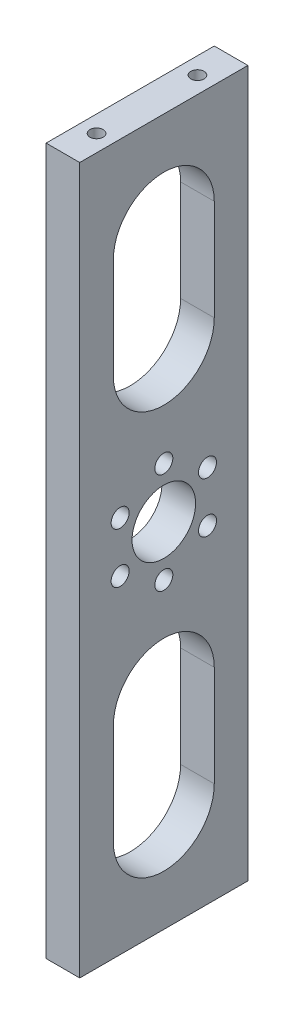
ISO-10303-21;
HEADER;
FILE_DESCRIPTION(('STEP AP214'),'2;1');
FILE_NAME('part.step','',(''),(''),'','','');
FILE_SCHEMA(('AUTOMOTIVE_DESIGN { 1 0 10303 214 1 1 1 1 }'));
ENDSEC;
DATA;
#1=APPLICATION_CONTEXT('core data for automotive mechanical design processes');
#2=APPLICATION_PROTOCOL_DEFINITION('international standard','automotive_design',2000,#1);
#3=PRODUCT_CONTEXT('',#1,'mechanical');
#4=PRODUCT('Part','Part','',(#3));
#5=PRODUCT_RELATED_PRODUCT_CATEGORY('part','',(#4));
#6=PRODUCT_DEFINITION_FORMATION('','',#4);
#7=PRODUCT_DEFINITION_CONTEXT('part definition',#1,'design');
#8=PRODUCT_DEFINITION('design','',#6,#7);
#9=PRODUCT_DEFINITION_SHAPE('','',#8);
#10=(LENGTH_UNIT() NAMED_UNIT(*) SI_UNIT(.MILLI.,.METRE.));
#11=(NAMED_UNIT(*) PLANE_ANGLE_UNIT() SI_UNIT($,.RADIAN.));
#12=(NAMED_UNIT(*) SI_UNIT($,.STERADIAN.) SOLID_ANGLE_UNIT());
#13=UNCERTAINTY_MEASURE_WITH_UNIT(LENGTH_MEASURE(1.E-05),#10,'distance_accuracy_value','');
#14=(GEOMETRIC_REPRESENTATION_CONTEXT(3) GLOBAL_UNCERTAINTY_ASSIGNED_CONTEXT((#13)) GLOBAL_UNIT_ASSIGNED_CONTEXT((#10,
#11,#12)) REPRESENTATION_CONTEXT('',''));
#15=CARTESIAN_POINT('',(0.,0.,0.));
#16=DIRECTION('',(0.,0.,1.));
#17=DIRECTION('',(1.,0.,0.));
#18=AXIS2_PLACEMENT_3D('',#15,#16,#17);
#19=CARTESIAN_POINT('',(3.175,-66.675,-15.875));
#20=DIRECTION('',(0.,0.,1.));
#21=DIRECTION('',(1.,0.,0.));
#22=AXIS2_PLACEMENT_3D('',#19,#20,#21);
#23=PLANE('',#22);
#24=DIRECTION('',(0.,1.,0.));
#25=VECTOR('',#24,1.);
#26=CARTESIAN_POINT('',(-3.175,-66.675,-15.875));
#27=LINE('',#26,#25);
#28=CARTESIAN_POINT('',(-3.175,-66.675,-15.875));
#29=VERTEX_POINT('',#28);
#30=CARTESIAN_POINT('',(-3.175,66.675,-15.875));
#31=VERTEX_POINT('',#30);
#32=EDGE_CURVE('E307',#29,#31,#27,.T.);
#33=ORIENTED_EDGE('',*,*,#32,.T.);
#34=DIRECTION('',(-1.,0.,0.));
#35=VECTOR('',#34,1.);
#36=CARTESIAN_POINT('',(3.175,66.675,-15.875));
#37=LINE('',#36,#35);
#38=CARTESIAN_POINT('',(3.175,66.675,-15.875));
#39=VERTEX_POINT('',#38);
#40=EDGE_CURVE('E11',#39,#31,#37,.T.);
#41=ORIENTED_EDGE('',*,*,#40,.F.);
#42=DIRECTION('',(0.,1.,0.));
#43=VECTOR('',#42,1.);
#44=CARTESIAN_POINT('',(3.175,-66.675,-15.875));
#45=LINE('',#44,#43);
#46=CARTESIAN_POINT('',(3.175,-66.675,-15.875));
#47=VERTEX_POINT('',#46);
#48=EDGE_CURVE('E308',#47,#39,#45,.T.);
#49=ORIENTED_EDGE('',*,*,#48,.F.);
#50=DIRECTION('',(-1.,0.,0.));
#51=VECTOR('',#50,1.);
#52=CARTESIAN_POINT('',(3.175,-66.675,-15.875));
#53=LINE('',#52,#51);
#54=EDGE_CURVE('E318',#47,#29,#53,.T.);
#55=ORIENTED_EDGE('',*,*,#54,.T.);
#56=EDGE_LOOP('',(#33,#41,#49,#55));
#57=FACE_BOUND('',#56,.T.);
#58=ADVANCED_FACE('F48',(#57),#23,.F.);
#59=CARTESIAN_POINT('',(3.175,66.675,15.875));
#60=DIRECTION('',(0.,-1.,0.));
#61=DIRECTION('',(0.,0.,-1.));
#62=AXIS2_PLACEMENT_3D('',#59,#60,#61);
#63=PLANE('',#62);
#64=CARTESIAN_POINT('',(0.,66.675,-9.525));
#65=DIRECTION('',(0.,1.,0.));
#66=DIRECTION('',(0.,0.,1.));
#67=AXIS2_PLACEMENT_3D('',#64,#65,#66);
#68=CIRCLE('',#67,1.25);
#69=CARTESIAN_POINT('',(0.,66.675,-8.275));
#70=VERTEX_POINT('',#69);
#71=EDGE_CURVE('E295',#70,#70,#68,.T.);
#72=ORIENTED_EDGE('',*,*,#71,.F.);
#73=EDGE_LOOP('',(#72));
#74=FACE_BOUND('',#73,.T.);
#75=CARTESIAN_POINT('',(0.,66.675,9.525));
#76=DIRECTION('',(0.,1.,0.));
#77=DIRECTION('',(0.,0.,1.));
#78=AXIS2_PLACEMENT_3D('',#75,#76,#77);
#79=CIRCLE('',#78,1.25);
#80=CARTESIAN_POINT('',(0.,66.675,10.775));
#81=VERTEX_POINT('',#80);
#82=EDGE_CURVE('E301',#81,#81,#79,.T.);
#83=ORIENTED_EDGE('',*,*,#82,.F.);
#84=EDGE_LOOP('',(#83));
#85=FACE_BOUND('',#84,.T.);
#86=DIRECTION('',(0.,0.,1.));
#87=VECTOR('',#86,1.);
#88=CARTESIAN_POINT('',(-3.175,66.675,15.875));
#89=LINE('',#88,#87);
#90=CARTESIAN_POINT('',(-3.175,66.675,15.875));
#91=VERTEX_POINT('',#90);
#92=EDGE_CURVE('E321',#31,#91,#89,.T.);
#93=ORIENTED_EDGE('',*,*,#92,.T.);
#94=DIRECTION('',(-1.,0.,0.));
#95=VECTOR('',#94,1.);
#96=CARTESIAN_POINT('',(3.175,66.675,15.875));
#97=LINE('',#96,#95);
#98=CARTESIAN_POINT('',(3.175,66.675,15.875));
#99=VERTEX_POINT('',#98);
#100=EDGE_CURVE('E56',#99,#91,#97,.T.);
#101=ORIENTED_EDGE('',*,*,#100,.F.);
#102=DIRECTION('',(0.,0.,1.));
#103=VECTOR('',#102,1.);
#104=CARTESIAN_POINT('',(3.175,66.675,15.875));
#105=LINE('',#104,#103);
#106=EDGE_CURVE('E311',#39,#99,#105,.T.);
#107=ORIENTED_EDGE('',*,*,#106,.F.);
#108=ORIENTED_EDGE('',*,*,#40,.T.);
#109=EDGE_LOOP('',(#93,#101,#107,#108));
#110=FACE_BOUND('',#109,.T.);
#111=ADVANCED_FACE('F363',(#74,#85,#110),#63,.F.);
#112=CARTESIAN_POINT('',(3.175,-66.675,15.875));
#113=DIRECTION('',(0.,0.,-1.));
#114=DIRECTION('',(-1.,0.,0.));
#115=AXIS2_PLACEMENT_3D('',#112,#113,#114);
#116=PLANE('',#115);
#117=DIRECTION('',(0.,-1.,0.));
#118=VECTOR('',#117,1.);
#119=CARTESIAN_POINT('',(-3.175,-66.675,15.875));
#120=LINE('',#119,#118);
#121=CARTESIAN_POINT('',(-3.175,-66.675,15.875));
#122=VERTEX_POINT('',#121);
#123=EDGE_CURVE('E323',#91,#122,#120,.T.);
#124=ORIENTED_EDGE('',*,*,#123,.T.);
#125=DIRECTION('',(-1.,0.,0.));
#126=VECTOR('',#125,1.);
#127=CARTESIAN_POINT('',(3.175,-66.675,15.875));
#128=LINE('',#127,#126);
#129=CARTESIAN_POINT('',(3.175,-66.675,15.875));
#130=VERTEX_POINT('',#129);
#131=EDGE_CURVE('E328',#130,#122,#128,.T.);
#132=ORIENTED_EDGE('',*,*,#131,.F.);
#133=DIRECTION('',(0.,-1.,0.));
#134=VECTOR('',#133,1.);
#135=CARTESIAN_POINT('',(3.175,-66.675,15.875));
#136=LINE('',#135,#134);
#137=EDGE_CURVE('E314',#99,#130,#136,.T.);
#138=ORIENTED_EDGE('',*,*,#137,.F.);
#139=ORIENTED_EDGE('',*,*,#100,.T.);
#140=EDGE_LOOP('',(#124,#132,#138,#139));
#141=FACE_BOUND('',#140,.T.);
#142=ADVANCED_FACE('F368',(#141),#116,.F.);
#143=CARTESIAN_POINT('',(3.175,-66.675,15.875));
#144=DIRECTION('',(0.,1.,0.));
#145=DIRECTION('',(0.,0.,1.));
#146=AXIS2_PLACEMENT_3D('',#143,#144,#145);
#147=PLANE('',#146);
#148=CARTESIAN_POINT('',(0.,-66.675,-9.525));
#149=DIRECTION('',(0.,-1.,0.));
#150=DIRECTION('',(0.,0.,-1.));
#151=AXIS2_PLACEMENT_3D('',#148,#149,#150);
#152=CIRCLE('',#151,1.25);
#153=CARTESIAN_POINT('',(0.,-66.675,-10.775));
#154=VERTEX_POINT('',#153);
#155=EDGE_CURVE('E283',#154,#154,#152,.T.);
#156=ORIENTED_EDGE('',*,*,#155,.F.);
#157=EDGE_LOOP('',(#156));
#158=FACE_BOUND('',#157,.T.);
#159=CARTESIAN_POINT('',(0.,-66.675,9.525));
#160=DIRECTION('',(0.,-1.,0.));
#161=DIRECTION('',(0.,0.,-1.));
#162=AXIS2_PLACEMENT_3D('',#159,#160,#161);
#163=CIRCLE('',#162,1.25);
#164=CARTESIAN_POINT('',(0.,-66.675,8.275));
#165=VERTEX_POINT('',#164);
#166=EDGE_CURVE('E289',#165,#165,#163,.T.);
#167=ORIENTED_EDGE('',*,*,#166,.F.);
#168=EDGE_LOOP('',(#167));
#169=FACE_BOUND('',#168,.T.);
#170=DIRECTION('',(0.,0.,-1.));
#171=VECTOR('',#170,1.);
#172=CARTESIAN_POINT('',(-3.175,-66.675,15.875));
#173=LINE('',#172,#171);
#174=EDGE_CURVE('E312',#122,#29,#173,.T.);
#175=ORIENTED_EDGE('',*,*,#174,.T.);
#176=ORIENTED_EDGE('',*,*,#54,.F.);
#177=DIRECTION('',(0.,0.,-1.));
#178=VECTOR('',#177,1.);
#179=CARTESIAN_POINT('',(3.175,-66.675,15.875));
#180=LINE('',#179,#178);
#181=EDGE_CURVE('E316',#130,#47,#180,.T.);
#182=ORIENTED_EDGE('',*,*,#181,.F.);
#183=ORIENTED_EDGE('',*,*,#131,.T.);
#184=EDGE_LOOP('',(#175,#176,#182,#183));
#185=FACE_BOUND('',#184,.T.);
#186=ADVANCED_FACE('F384',(#158,#169,#185),#147,.F.);
#187=CARTESIAN_POINT('',(3.175,0.,0.));
#188=DIRECTION('',(-1.,0.,0.));
#189=DIRECTION('',(0.,0.,1.));
#190=AXIS2_PLACEMENT_3D('',#187,#188,#189);
#191=PLANE('',#190);
#192=CARTESIAN_POINT('',(3.175,-47.625,0.));
#193=DIRECTION('',(1.,0.,0.));
#194=DIRECTION('',(0.,0.,-1.));
#195=AXIS2_PLACEMENT_3D('',#192,#193,#194);
#196=CIRCLE('',#195,9.525);
#197=CARTESIAN_POINT('',(3.175,-47.625,9.52499999999999));
#198=VERTEX_POINT('',#197);
#199=CARTESIAN_POINT('',(3.175,-47.625,-9.52500000000001));
#200=VERTEX_POINT('',#199);
#201=EDGE_CURVE('E180',#198,#200,#196,.T.);
#202=ORIENTED_EDGE('',*,*,#201,.F.);
#203=DIRECTION('',(0.,-1.,0.));
#204=VECTOR('',#203,1.);
#205=CARTESIAN_POINT('',(3.175,0.,9.525));
#206=LINE('',#205,#204);
#207=CARTESIAN_POINT('',(3.175,-28.575,9.52499999999999));
#208=VERTEX_POINT('',#207);
#209=EDGE_CURVE('E64',#208,#198,#206,.T.);
#210=ORIENTED_EDGE('',*,*,#209,.F.);
#211=CARTESIAN_POINT('',(3.175,-28.575,0.));
#212=DIRECTION('',(1.,0.,0.));
#213=DIRECTION('',(0.,0.,-1.));
#214=AXIS2_PLACEMENT_3D('',#211,#212,#213);
#215=CIRCLE('',#214,9.525);
#216=CARTESIAN_POINT('',(3.175,-28.575,-9.52500000000001));
#217=VERTEX_POINT('',#216);
#218=EDGE_CURVE('E171',#217,#208,#215,.T.);
#219=ORIENTED_EDGE('',*,*,#218,.F.);
#220=DIRECTION('',(0.,-1.,0.));
#221=VECTOR('',#220,1.);
#222=CARTESIAN_POINT('',(3.175,0.,-9.525));
#223=LINE('',#222,#221);
#224=EDGE_CURVE('E174',#217,#200,#223,.T.);
#225=ORIENTED_EDGE('',*,*,#224,.T.);
#226=EDGE_LOOP('',(#202,#210,#219,#225));
#227=FACE_BOUND('',#226,.T.);
#228=DIRECTION('',(0.,-1.,0.));
#229=VECTOR('',#228,1.);
#230=CARTESIAN_POINT('',(3.175,47.625,9.525));
#231=LINE('',#230,#229);
#232=CARTESIAN_POINT('',(3.175,47.625,9.525));
#233=VERTEX_POINT('',#232);
#234=CARTESIAN_POINT('',(3.175,28.575,9.525));
#235=VERTEX_POINT('',#234);
#236=EDGE_CURVE('E206',#233,#235,#231,.T.);
#237=ORIENTED_EDGE('',*,*,#236,.F.);
#238=CARTESIAN_POINT('',(3.175,47.625,0.));
#239=DIRECTION('',(1.,0.,0.));
#240=DIRECTION('',(0.,0.,-1.));
#241=AXIS2_PLACEMENT_3D('',#238,#239,#240);
#242=CIRCLE('',#241,9.525);
#243=CARTESIAN_POINT('',(3.175,47.625,-9.525));
#244=VERTEX_POINT('',#243);
#245=EDGE_CURVE('E72',#244,#233,#242,.T.);
#246=ORIENTED_EDGE('',*,*,#245,.F.);
#247=DIRECTION('',(0.,-1.,0.));
#248=VECTOR('',#247,1.);
#249=CARTESIAN_POINT('',(3.175,47.625,-9.525));
#250=LINE('',#249,#248);
#251=CARTESIAN_POINT('',(3.175,28.575,-9.525));
#252=VERTEX_POINT('',#251);
#253=EDGE_CURVE('E199',#244,#252,#250,.T.);
#254=ORIENTED_EDGE('',*,*,#253,.T.);
#255=CARTESIAN_POINT('',(3.175,28.575,0.));
#256=DIRECTION('',(1.,0.,0.));
#257=DIRECTION('',(0.,0.,-1.));
#258=AXIS2_PLACEMENT_3D('',#255,#256,#257);
#259=CIRCLE('',#258,9.525);
#260=EDGE_CURVE('E202',#235,#252,#259,.T.);
#261=ORIENTED_EDGE('',*,*,#260,.F.);
#262=EDGE_LOOP('',(#237,#246,#254,#261));
#263=FACE_BOUND('',#262,.T.);
#264=CARTESIAN_POINT('',(3.175,-4.7625000000002,8.24889197104666));
#265=DIRECTION('',(-1.,0.,0.));
#266=DIRECTION('',(0.,0.,1.));
#267=AXIS2_PLACEMENT_3D('',#264,#265,#266);
#268=CIRCLE('',#267,1.7);
#269=CARTESIAN_POINT('',(3.175,-4.7625000000002,9.94889197104666));
#270=VERTEX_POINT('',#269);
#271=EDGE_CURVE('E51',#270,#270,#268,.T.);
#272=ORIENTED_EDGE('',*,*,#271,.T.);
#273=EDGE_LOOP('',(#272));
#274=FACE_BOUND('',#273,.T.);
#275=CARTESIAN_POINT('',(3.175,4.76249999999976,8.24889197104673));
#276=DIRECTION('',(-1.,0.,0.));
#277=DIRECTION('',(0.,0.,1.));
#278=AXIS2_PLACEMENT_3D('',#275,#276,#277);
#279=CIRCLE('',#278,1.7);
#280=CARTESIAN_POINT('',(3.175,4.76249999999976,9.94889197104673));
#281=VERTEX_POINT('',#280);
#282=EDGE_CURVE('E236',#281,#281,#279,.T.);
#283=ORIENTED_EDGE('',*,*,#282,.T.);
#284=EDGE_LOOP('',(#283));
#285=FACE_BOUND('',#284,.T.);
#286=CARTESIAN_POINT('',(3.175,9.52499999999983,0.));
#287=DIRECTION('',(-1.,0.,0.));
#288=DIRECTION('',(0.,0.,1.));
#289=AXIS2_PLACEMENT_3D('',#286,#287,#288);
#290=CIRCLE('',#289,1.7);
#291=CARTESIAN_POINT('',(3.175,9.52499999999983,1.69999999999997));
#292=VERTEX_POINT('',#291);
#293=EDGE_CURVE('E246',#292,#292,#290,.T.);
#294=ORIENTED_EDGE('',*,*,#293,.T.);
#295=EDGE_LOOP('',(#294));
#296=FACE_BOUND('',#295,.T.);
#297=CARTESIAN_POINT('',(3.175,4.76249999999987,-8.24889197104686));
#298=DIRECTION('',(-1.,0.,0.));
#299=DIRECTION('',(0.,0.,1.));
#300=AXIS2_PLACEMENT_3D('',#297,#298,#299);
#301=CIRCLE('',#300,1.7);
#302=CARTESIAN_POINT('',(3.175,4.76249999999987,-6.54889197104686));
#303=VERTEX_POINT('',#302);
#304=EDGE_CURVE('E256',#303,#303,#301,.T.);
#305=ORIENTED_EDGE('',*,*,#304,.T.);
#306=EDGE_LOOP('',(#305));
#307=FACE_BOUND('',#306,.T.);
#308=CARTESIAN_POINT('',(3.175,-4.76250000000004,-8.24889197104696));
#309=DIRECTION('',(-1.,0.,0.));
#310=DIRECTION('',(0.,0.,1.));
#311=AXIS2_PLACEMENT_3D('',#308,#309,#310);
#312=CIRCLE('',#311,1.7);
#313=CARTESIAN_POINT('',(3.175,-4.76250000000004,-6.54889197104696));
#314=VERTEX_POINT('',#313);
#315=EDGE_CURVE('E266',#314,#314,#312,.T.);
#316=ORIENTED_EDGE('',*,*,#315,.T.);
#317=EDGE_LOOP('',(#316));
#318=FACE_BOUND('',#317,.T.);
#319=CARTESIAN_POINT('',(3.175,-9.52500000000017,-2.30718222304915E-13));
#320=DIRECTION('',(-1.,0.,0.));
#321=DIRECTION('',(0.,0.,1.));
#322=AXIS2_PLACEMENT_3D('',#319,#320,#321);
#323=CIRCLE('',#322,1.7);
#324=CARTESIAN_POINT('',(3.175,-9.52500000000017,1.69999999999977));
#325=VERTEX_POINT('',#324);
#326=EDGE_CURVE('E276',#325,#325,#323,.T.);
#327=ORIENTED_EDGE('',*,*,#326,.T.);
#328=EDGE_LOOP('',(#327));
#329=FACE_BOUND('',#328,.T.);
#330=CARTESIAN_POINT('',(3.175,-1.66539606842861E-13,0.));
#331=DIRECTION('',(-1.,0.,0.));
#332=DIRECTION('',(0.,0.,1.));
#333=AXIS2_PLACEMENT_3D('',#330,#331,#332);
#334=CIRCLE('',#333,6.);
#335=CARTESIAN_POINT('',(3.175,-1.66539606842861E-13,6.00000000000002));
#336=VERTEX_POINT('',#335);
#337=EDGE_CURVE('E280',#336,#336,#334,.T.);
#338=ORIENTED_EDGE('',*,*,#337,.T.);
#339=EDGE_LOOP('',(#338));
#340=FACE_BOUND('',#339,.T.);
#341=ORIENTED_EDGE('',*,*,#48,.T.);
#342=ORIENTED_EDGE('',*,*,#106,.T.);
#343=ORIENTED_EDGE('',*,*,#137,.T.);
#344=ORIENTED_EDGE('',*,*,#181,.T.);
#345=EDGE_LOOP('',(#341,#342,#343,#344));
#346=FACE_BOUND('',#345,.T.);
#347=ADVANCED_FACE('F343',(#227,#263,#274,#285,#296,#307,#318,#329,#340,#346),#191,.F.);
#348=CARTESIAN_POINT('',(-3.175,0.,0.));
#349=DIRECTION('',(-1.,0.,0.));
#350=DIRECTION('',(0.,0.,1.));
#351=AXIS2_PLACEMENT_3D('',#348,#349,#350);
#352=PLANE('',#351);
#353=DIRECTION('',(0.,-1.,0.));
#354=VECTOR('',#353,1.);
#355=CARTESIAN_POINT('',(-3.175,0.,9.525));
#356=LINE('',#355,#354);
#357=CARTESIAN_POINT('',(-3.175,-28.575,9.52499999999999));
#358=VERTEX_POINT('',#357);
#359=CARTESIAN_POINT('',(-3.175,-47.625,9.52499999999999));
#360=VERTEX_POINT('',#359);
#361=EDGE_CURVE('E152',#358,#360,#356,.T.);
#362=ORIENTED_EDGE('',*,*,#361,.T.);
#363=CARTESIAN_POINT('',(-3.175,-47.625,0.));
#364=DIRECTION('',(1.,0.,0.));
#365=DIRECTION('',(0.,0.,-1.));
#366=AXIS2_PLACEMENT_3D('',#363,#364,#365);
#367=CIRCLE('',#366,9.525);
#368=CARTESIAN_POINT('',(-3.175,-47.625,-9.52500000000001));
#369=VERTEX_POINT('',#368);
#370=EDGE_CURVE('E161',#360,#369,#367,.T.);
#371=ORIENTED_EDGE('',*,*,#370,.T.);
#372=DIRECTION('',(0.,-1.,0.));
#373=VECTOR('',#372,1.);
#374=CARTESIAN_POINT('',(-3.175,0.,-9.525));
#375=LINE('',#374,#373);
#376=CARTESIAN_POINT('',(-3.175,-28.575,-9.52500000000001));
#377=VERTEX_POINT('',#376);
#378=EDGE_CURVE('E166',#377,#369,#375,.T.);
#379=ORIENTED_EDGE('',*,*,#378,.F.);
#380=CARTESIAN_POINT('',(-3.175,-28.575,0.));
#381=DIRECTION('',(1.,0.,0.));
#382=DIRECTION('',(0.,0.,-1.));
#383=AXIS2_PLACEMENT_3D('',#380,#381,#382);
#384=CIRCLE('',#383,9.525);
#385=EDGE_CURVE('E158',#377,#358,#384,.T.);
#386=ORIENTED_EDGE('',*,*,#385,.T.);
#387=EDGE_LOOP('',(#362,#371,#379,#386));
#388=FACE_BOUND('',#387,.T.);
#389=CARTESIAN_POINT('',(-3.175,47.625,0.));
#390=DIRECTION('',(1.,0.,0.));
#391=DIRECTION('',(0.,0.,-1.));
#392=AXIS2_PLACEMENT_3D('',#389,#390,#391);
#393=CIRCLE('',#392,9.525);
#394=CARTESIAN_POINT('',(-3.175,47.625,-9.525));
#395=VERTEX_POINT('',#394);
#396=CARTESIAN_POINT('',(-3.175,47.625,9.525));
#397=VERTEX_POINT('',#396);
#398=EDGE_CURVE('E203',#395,#397,#393,.T.);
#399=ORIENTED_EDGE('',*,*,#398,.T.);
#400=DIRECTION('',(0.,-1.,0.));
#401=VECTOR('',#400,1.);
#402=CARTESIAN_POINT('',(-3.175,47.625,9.525));
#403=LINE('',#402,#401);
#404=CARTESIAN_POINT('',(-3.175,28.575,9.525));
#405=VERTEX_POINT('',#404);
#406=EDGE_CURVE('E214',#397,#405,#403,.T.);
#407=ORIENTED_EDGE('',*,*,#406,.T.);
#408=CARTESIAN_POINT('',(-3.175,28.575,0.));
#409=DIRECTION('',(1.,0.,0.));
#410=DIRECTION('',(0.,0.,-1.));
#411=AXIS2_PLACEMENT_3D('',#408,#409,#410);
#412=CIRCLE('',#411,9.525);
#413=CARTESIAN_POINT('',(-3.175,28.575,-9.525));
#414=VERTEX_POINT('',#413);
#415=EDGE_CURVE('E211',#405,#414,#412,.T.);
#416=ORIENTED_EDGE('',*,*,#415,.T.);
#417=DIRECTION('',(0.,-1.,0.));
#418=VECTOR('',#417,1.);
#419=CARTESIAN_POINT('',(-3.175,47.625,-9.525));
#420=LINE('',#419,#418);
#421=EDGE_CURVE('E192',#395,#414,#420,.T.);
#422=ORIENTED_EDGE('',*,*,#421,.F.);
#423=EDGE_LOOP('',(#399,#407,#416,#422));
#424=FACE_BOUND('',#423,.T.);
#425=CARTESIAN_POINT('',(-3.175,-4.7625000000002,8.24889197104666));
#426=DIRECTION('',(-1.,0.,0.));
#427=DIRECTION('',(0.,0.,1.));
#428=AXIS2_PLACEMENT_3D('',#425,#426,#427);
#429=CIRCLE('',#428,2.25);
#430=CARTESIAN_POINT('',(-3.175,-4.7625000000002,10.4988919710467));
#431=VERTEX_POINT('',#430);
#432=EDGE_CURVE('E186',#431,#431,#429,.T.);
#433=ORIENTED_EDGE('',*,*,#432,.F.);
#434=EDGE_LOOP('',(#433));
#435=FACE_BOUND('',#434,.T.);
#436=CARTESIAN_POINT('',(-3.175,4.76249999999976,8.24889197104673));
#437=DIRECTION('',(-1.,0.,0.));
#438=DIRECTION('',(0.,0.,1.));
#439=AXIS2_PLACEMENT_3D('',#436,#437,#438);
#440=CIRCLE('',#439,2.25);
#441=CARTESIAN_POINT('',(-3.175,4.76249999999976,10.4988919710467));
#442=VERTEX_POINT('',#441);
#443=EDGE_CURVE('E227',#442,#442,#440,.T.);
#444=ORIENTED_EDGE('',*,*,#443,.F.);
#445=EDGE_LOOP('',(#444));
#446=FACE_BOUND('',#445,.T.);
#447=CARTESIAN_POINT('',(-3.175,9.52499999999983,0.));
#448=DIRECTION('',(-1.,0.,0.));
#449=DIRECTION('',(0.,0.,1.));
#450=AXIS2_PLACEMENT_3D('',#447,#448,#449);
#451=CIRCLE('',#450,2.25);
#452=CARTESIAN_POINT('',(-3.175,9.52499999999983,2.24999999999996));
#453=VERTEX_POINT('',#452);
#454=EDGE_CURVE('E237',#453,#453,#451,.T.);
#455=ORIENTED_EDGE('',*,*,#454,.F.);
#456=EDGE_LOOP('',(#455));
#457=FACE_BOUND('',#456,.T.);
#458=CARTESIAN_POINT('',(-3.175,4.76249999999987,-8.24889197104686));
#459=DIRECTION('',(-1.,0.,0.));
#460=DIRECTION('',(0.,0.,1.));
#461=AXIS2_PLACEMENT_3D('',#458,#459,#460);
#462=CIRCLE('',#461,2.25);
#463=CARTESIAN_POINT('',(-3.175,4.76249999999987,-5.99889197104686));
#464=VERTEX_POINT('',#463);
#465=EDGE_CURVE('E247',#464,#464,#462,.T.);
#466=ORIENTED_EDGE('',*,*,#465,.F.);
#467=EDGE_LOOP('',(#466));
#468=FACE_BOUND('',#467,.T.);
#469=CARTESIAN_POINT('',(-3.175,-4.76250000000004,-8.24889197104696));
#470=DIRECTION('',(-1.,0.,0.));
#471=DIRECTION('',(0.,0.,1.));
#472=AXIS2_PLACEMENT_3D('',#469,#470,#471);
#473=CIRCLE('',#472,2.25);
#474=CARTESIAN_POINT('',(-3.175,-4.76250000000004,-5.99889197104697));
#475=VERTEX_POINT('',#474);
#476=EDGE_CURVE('E257',#475,#475,#473,.T.);
#477=ORIENTED_EDGE('',*,*,#476,.F.);
#478=EDGE_LOOP('',(#477));
#479=FACE_BOUND('',#478,.T.);
#480=CARTESIAN_POINT('',(-3.175,-9.52500000000017,-2.30718222304915E-13));
#481=DIRECTION('',(-1.,0.,0.));
#482=DIRECTION('',(0.,0.,1.));
#483=AXIS2_PLACEMENT_3D('',#480,#481,#482);
#484=CIRCLE('',#483,2.25);
#485=CARTESIAN_POINT('',(-3.175,-9.52500000000017,2.24999999999976));
#486=VERTEX_POINT('',#485);
#487=EDGE_CURVE('E267',#486,#486,#484,.T.);
#488=ORIENTED_EDGE('',*,*,#487,.F.);
#489=EDGE_LOOP('',(#488));
#490=FACE_BOUND('',#489,.T.);
#491=CARTESIAN_POINT('',(-3.175,-1.66539606842861E-13,0.));
#492=DIRECTION('',(-1.,0.,0.));
#493=DIRECTION('',(0.,0.,1.));
#494=AXIS2_PLACEMENT_3D('',#491,#492,#493);
#495=CIRCLE('',#494,5.99999999999999);
#496=CARTESIAN_POINT('',(-3.175,-1.66539606842861E-13,6.00000000000002));
#497=VERTEX_POINT('',#496);
#498=EDGE_CURVE('E277',#497,#497,#495,.T.);
#499=ORIENTED_EDGE('',*,*,#498,.F.);
#500=EDGE_LOOP('',(#499));
#501=FACE_BOUND('',#500,.T.);
#502=ORIENTED_EDGE('',*,*,#32,.F.);
#503=ORIENTED_EDGE('',*,*,#174,.F.);
#504=ORIENTED_EDGE('',*,*,#123,.F.);
#505=ORIENTED_EDGE('',*,*,#92,.F.);
#506=EDGE_LOOP('',(#502,#503,#504,#505));
#507=FACE_BOUND('',#506,.T.);
#508=ADVANCED_FACE('F168',(#388,#424,#435,#446,#457,#468,#479,#490,#501,#507),#352,.T.);
#509=CARTESIAN_POINT('',(0.,53.975,9.525));
#510=DIRECTION('',(0.,1.,0.));
#511=DIRECTION('',(0.,0.,1.));
#512=AXIS2_PLACEMENT_3D('',#509,#510,#511);
#513=CONICAL_SURFACE('',#512,1.25,1.02974425867665);
#514=CARTESIAN_POINT('',(0.,53.2239242262155,9.525));
#515=VERTEX_POINT('',#514);
#516=VERTEX_LOOP('',#515);
#517=FACE_BOUND('',#516,.T.);
#518=CARTESIAN_POINT('',(0.,53.975,9.525));
#519=DIRECTION('',(0.,1.,0.));
#520=DIRECTION('',(0.,0.,1.));
#521=AXIS2_PLACEMENT_3D('',#518,#519,#520);
#522=CIRCLE('',#521,1.25);
#523=CARTESIAN_POINT('',(0.,53.975,10.775));
#524=VERTEX_POINT('',#523);
#525=EDGE_CURVE('E304',#524,#524,#522,.T.);
#526=ORIENTED_EDGE('',*,*,#525,.T.);
#527=EDGE_LOOP('',(#526));
#528=FACE_BOUND('',#527,.T.);
#529=ADVANCED_FACE('F396',(#517,#528),#513,.F.);
#530=CARTESIAN_POINT('',(0.,66.675,9.525));
#531=DIRECTION('',(0.,1.,0.));
#532=DIRECTION('',(0.,0.,1.));
#533=AXIS2_PLACEMENT_3D('',#530,#531,#532);
#534=CYLINDRICAL_SURFACE('',#533,1.25);
#535=ORIENTED_EDGE('',*,*,#525,.F.);
#536=EDGE_LOOP('',(#535));
#537=FACE_BOUND('',#536,.T.);
#538=ORIENTED_EDGE('',*,*,#82,.T.);
#539=EDGE_LOOP('',(#538));
#540=FACE_BOUND('',#539,.T.);
#541=ADVANCED_FACE('F402',(#537,#540),#534,.F.);
#542=CARTESIAN_POINT('',(0.,53.975,-9.525));
#543=DIRECTION('',(0.,1.,0.));
#544=DIRECTION('',(0.,0.,1.));
#545=AXIS2_PLACEMENT_3D('',#542,#543,#544);
#546=CONICAL_SURFACE('',#545,1.25,1.02974425867665);
#547=CARTESIAN_POINT('',(0.,53.2239242262155,-9.525));
#548=VERTEX_POINT('',#547);
#549=VERTEX_LOOP('',#548);
#550=FACE_BOUND('',#549,.T.);
#551=CARTESIAN_POINT('',(0.,53.975,-9.525));
#552=DIRECTION('',(0.,1.,0.));
#553=DIRECTION('',(0.,0.,1.));
#554=AXIS2_PLACEMENT_3D('',#551,#552,#553);
#555=CIRCLE('',#554,1.25);
#556=CARTESIAN_POINT('',(0.,53.975,-8.275));
#557=VERTEX_POINT('',#556);
#558=EDGE_CURVE('E298',#557,#557,#555,.T.);
#559=ORIENTED_EDGE('',*,*,#558,.T.);
#560=EDGE_LOOP('',(#559));
#561=FACE_BOUND('',#560,.T.);
#562=ADVANCED_FACE('F406',(#550,#561),#546,.F.);
#563=CARTESIAN_POINT('',(0.,66.675,-9.525));
#564=DIRECTION('',(0.,1.,0.));
#565=DIRECTION('',(0.,0.,1.));
#566=AXIS2_PLACEMENT_3D('',#563,#564,#565);
#567=CYLINDRICAL_SURFACE('',#566,1.25);
#568=ORIENTED_EDGE('',*,*,#558,.F.);
#569=EDGE_LOOP('',(#568));
#570=FACE_BOUND('',#569,.T.);
#571=ORIENTED_EDGE('',*,*,#71,.T.);
#572=EDGE_LOOP('',(#571));
#573=FACE_BOUND('',#572,.T.);
#574=ADVANCED_FACE('F410',(#570,#573),#567,.F.);
#575=CARTESIAN_POINT('',(0.,-53.975,9.525));
#576=DIRECTION('',(0.,-1.,0.));
#577=DIRECTION('',(0.,0.,-1.));
#578=AXIS2_PLACEMENT_3D('',#575,#576,#577);
#579=CONICAL_SURFACE('',#578,1.25,1.02974425867665);
#580=CARTESIAN_POINT('',(0.,-53.2239242262155,9.525));
#581=VERTEX_POINT('',#580);
#582=VERTEX_LOOP('',#581);
#583=FACE_BOUND('',#582,.T.);
#584=CARTESIAN_POINT('',(0.,-53.975,9.525));
#585=DIRECTION('',(0.,-1.,0.));
#586=DIRECTION('',(0.,0.,-1.));
#587=AXIS2_PLACEMENT_3D('',#584,#585,#586);
#588=CIRCLE('',#587,1.25);
#589=CARTESIAN_POINT('',(0.,-53.975,8.275));
#590=VERTEX_POINT('',#589);
#591=EDGE_CURVE('E292',#590,#590,#588,.T.);
#592=ORIENTED_EDGE('',*,*,#591,.T.);
#593=EDGE_LOOP('',(#592));
#594=FACE_BOUND('',#593,.T.);
#595=ADVANCED_FACE('F414',(#583,#594),#579,.F.);
#596=CARTESIAN_POINT('',(0.,-66.675,9.525));
#597=DIRECTION('',(0.,-1.,0.));
#598=DIRECTION('',(0.,0.,-1.));
#599=AXIS2_PLACEMENT_3D('',#596,#597,#598);
#600=CYLINDRICAL_SURFACE('',#599,1.25);
#601=ORIENTED_EDGE('',*,*,#591,.F.);
#602=EDGE_LOOP('',(#601));
#603=FACE_BOUND('',#602,.T.);
#604=ORIENTED_EDGE('',*,*,#166,.T.);
#605=EDGE_LOOP('',(#604));
#606=FACE_BOUND('',#605,.T.);
#607=ADVANCED_FACE('F418',(#603,#606),#600,.F.);
#608=CARTESIAN_POINT('',(0.,-53.975,-9.525));
#609=DIRECTION('',(0.,-1.,0.));
#610=DIRECTION('',(0.,0.,-1.));
#611=AXIS2_PLACEMENT_3D('',#608,#609,#610);
#612=CONICAL_SURFACE('',#611,1.25,1.02974425867665);
#613=CARTESIAN_POINT('',(0.,-53.2239242262155,-9.525));
#614=VERTEX_POINT('',#613);
#615=VERTEX_LOOP('',#614);
#616=FACE_BOUND('',#615,.T.);
#617=CARTESIAN_POINT('',(0.,-53.975,-9.525));
#618=DIRECTION('',(0.,-1.,0.));
#619=DIRECTION('',(0.,0.,-1.));
#620=AXIS2_PLACEMENT_3D('',#617,#618,#619);
#621=CIRCLE('',#620,1.25);
#622=CARTESIAN_POINT('',(0.,-53.975,-10.775));
#623=VERTEX_POINT('',#622);
#624=EDGE_CURVE('E286',#623,#623,#621,.T.);
#625=ORIENTED_EDGE('',*,*,#624,.T.);
#626=EDGE_LOOP('',(#625));
#627=FACE_BOUND('',#626,.T.);
#628=ADVANCED_FACE('F422',(#616,#627),#612,.F.);
#629=CARTESIAN_POINT('',(0.,-66.675,-9.525));
#630=DIRECTION('',(0.,-1.,0.));
#631=DIRECTION('',(0.,0.,-1.));
#632=AXIS2_PLACEMENT_3D('',#629,#630,#631);
#633=CYLINDRICAL_SURFACE('',#632,1.25);
#634=ORIENTED_EDGE('',*,*,#624,.F.);
#635=EDGE_LOOP('',(#634));
#636=FACE_BOUND('',#635,.T.);
#637=ORIENTED_EDGE('',*,*,#155,.T.);
#638=EDGE_LOOP('',(#637));
#639=FACE_BOUND('',#638,.T.);
#640=ADVANCED_FACE('F426',(#636,#639),#633,.F.);
#641=CARTESIAN_POINT('',(-3.175,-1.66539606842861E-13,0.));
#642=DIRECTION('',(-1.,0.,0.));
#643=DIRECTION('',(0.,0.,1.));
#644=AXIS2_PLACEMENT_3D('',#641,#642,#643);
#645=CYLINDRICAL_SURFACE('',#644,5.99999999999999);
#646=ORIENTED_EDGE('',*,*,#337,.F.);
#647=EDGE_LOOP('',(#646));
#648=FACE_BOUND('',#647,.T.);
#649=ORIENTED_EDGE('',*,*,#498,.T.);
#650=EDGE_LOOP('',(#649));
#651=FACE_BOUND('',#650,.T.);
#652=ADVANCED_FACE('F430',(#648,#651),#645,.F.);
#653=CARTESIAN_POINT('',(-3.175,-9.52500000000017,-2.30718222304915E-13));
#654=DIRECTION('',(-1.,0.,0.));
#655=DIRECTION('',(0.,0.,1.));
#656=AXIS2_PLACEMENT_3D('',#653,#654,#655);
#657=CYLINDRICAL_SURFACE('',#656,1.7);
#658=CARTESIAN_POINT('',(-1.175,-9.52500000000017,-2.30718222304915E-13));
#659=DIRECTION('',(-1.,0.,0.));
#660=DIRECTION('',(0.,0.,1.));
#661=AXIS2_PLACEMENT_3D('',#658,#659,#660);
#662=CIRCLE('',#661,1.7);
#663=CARTESIAN_POINT('',(-1.175,-9.52500000000017,1.69999999999977));
#664=VERTEX_POINT('',#663);
#665=EDGE_CURVE('E273',#664,#664,#662,.T.);
#666=ORIENTED_EDGE('',*,*,#665,.T.);
#667=EDGE_LOOP('',(#666));
#668=FACE_BOUND('',#667,.T.);
#669=ORIENTED_EDGE('',*,*,#326,.F.);
#670=EDGE_LOOP('',(#669));
#671=FACE_BOUND('',#670,.T.);
#672=ADVANCED_FACE('F434',(#668,#671),#657,.F.);
#673=CARTESIAN_POINT('',(-1.175,-7.82500000000017,-2.30718222304915E-13));
#674=DIRECTION('',(1.,0.,0.));
#675=DIRECTION('',(0.,0.,-1.));
#676=AXIS2_PLACEMENT_3D('',#673,#674,#675);
#677=PLANE('',#676);
#678=ORIENTED_EDGE('',*,*,#665,.F.);
#679=EDGE_LOOP('',(#678));
#680=FACE_BOUND('',#679,.T.);
#681=CARTESIAN_POINT('',(-1.175,-9.52500000000017,-2.30718222304915E-13));
#682=DIRECTION('',(-1.,0.,0.));
#683=DIRECTION('',(0.,0.,1.));
#684=AXIS2_PLACEMENT_3D('',#681,#682,#683);
#685=CIRCLE('',#684,2.25);
#686=CARTESIAN_POINT('',(-1.175,-9.52500000000017,2.24999999999976));
#687=VERTEX_POINT('',#686);
#688=EDGE_CURVE('E270',#687,#687,#685,.T.);
#689=ORIENTED_EDGE('',*,*,#688,.T.);
#690=EDGE_LOOP('',(#689));
#691=FACE_BOUND('',#690,.T.);
#692=ADVANCED_FACE('F438',(#680,#691),#677,.F.);
#693=CARTESIAN_POINT('',(-3.175,-9.52500000000017,-2.30718222304915E-13));
#694=DIRECTION('',(-1.,0.,0.));
#695=DIRECTION('',(0.,0.,1.));
#696=AXIS2_PLACEMENT_3D('',#693,#694,#695);
#697=CYLINDRICAL_SURFACE('',#696,2.25);
#698=ORIENTED_EDGE('',*,*,#688,.F.);
#699=EDGE_LOOP('',(#698));
#700=FACE_BOUND('',#699,.T.);
#701=ORIENTED_EDGE('',*,*,#487,.T.);
#702=EDGE_LOOP('',(#701));
#703=FACE_BOUND('',#702,.T.);
#704=ADVANCED_FACE('F442',(#700,#703),#697,.F.);
#705=CARTESIAN_POINT('',(-3.175,-4.76250000000004,-8.24889197104696));
#706=DIRECTION('',(-1.,0.,0.));
#707=DIRECTION('',(0.,0.,1.));
#708=AXIS2_PLACEMENT_3D('',#705,#706,#707);
#709=CYLINDRICAL_SURFACE('',#708,1.7);
#710=CARTESIAN_POINT('',(-1.175,-4.76250000000004,-8.24889197104696));
#711=DIRECTION('',(-1.,0.,0.));
#712=DIRECTION('',(0.,0.,1.));
#713=AXIS2_PLACEMENT_3D('',#710,#711,#712);
#714=CIRCLE('',#713,1.7);
#715=CARTESIAN_POINT('',(-1.175,-4.76250000000004,-6.54889197104696));
#716=VERTEX_POINT('',#715);
#717=EDGE_CURVE('E263',#716,#716,#714,.T.);
#718=ORIENTED_EDGE('',*,*,#717,.T.);
#719=EDGE_LOOP('',(#718));
#720=FACE_BOUND('',#719,.T.);
#721=ORIENTED_EDGE('',*,*,#315,.F.);
#722=EDGE_LOOP('',(#721));
#723=FACE_BOUND('',#722,.T.);
#724=ADVANCED_FACE('F446',(#720,#723),#709,.F.);
#725=CARTESIAN_POINT('',(-1.175,-3.06250000000004,-8.24889197104696));
#726=DIRECTION('',(1.,0.,0.));
#727=DIRECTION('',(0.,0.,-1.));
#728=AXIS2_PLACEMENT_3D('',#725,#726,#727);
#729=PLANE('',#728);
#730=ORIENTED_EDGE('',*,*,#717,.F.);
#731=EDGE_LOOP('',(#730));
#732=FACE_BOUND('',#731,.T.);
#733=CARTESIAN_POINT('',(-1.175,-4.76250000000004,-8.24889197104696));
#734=DIRECTION('',(-1.,0.,0.));
#735=DIRECTION('',(0.,0.,1.));
#736=AXIS2_PLACEMENT_3D('',#733,#734,#735);
#737=CIRCLE('',#736,2.25);
#738=CARTESIAN_POINT('',(-1.175,-4.76250000000004,-5.99889197104697));
#739=VERTEX_POINT('',#738);
#740=EDGE_CURVE('E260',#739,#739,#737,.T.);
#741=ORIENTED_EDGE('',*,*,#740,.T.);
#742=EDGE_LOOP('',(#741));
#743=FACE_BOUND('',#742,.T.);
#744=ADVANCED_FACE('F450',(#732,#743),#729,.F.);
#745=CARTESIAN_POINT('',(-3.175,-4.76250000000004,-8.24889197104696));
#746=DIRECTION('',(-1.,0.,0.));
#747=DIRECTION('',(0.,0.,1.));
#748=AXIS2_PLACEMENT_3D('',#745,#746,#747);
#749=CYLINDRICAL_SURFACE('',#748,2.25);
#750=ORIENTED_EDGE('',*,*,#740,.F.);
#751=EDGE_LOOP('',(#750));
#752=FACE_BOUND('',#751,.T.);
#753=ORIENTED_EDGE('',*,*,#476,.T.);
#754=EDGE_LOOP('',(#753));
#755=FACE_BOUND('',#754,.T.);
#756=ADVANCED_FACE('F454',(#752,#755),#749,.F.);
#757=CARTESIAN_POINT('',(-3.175,4.76249999999987,-8.24889197104686));
#758=DIRECTION('',(-1.,0.,0.));
#759=DIRECTION('',(0.,0.,1.));
#760=AXIS2_PLACEMENT_3D('',#757,#758,#759);
#761=CYLINDRICAL_SURFACE('',#760,1.7);
#762=CARTESIAN_POINT('',(-1.175,4.76249999999987,-8.24889197104686));
#763=DIRECTION('',(-1.,0.,0.));
#764=DIRECTION('',(0.,0.,1.));
#765=AXIS2_PLACEMENT_3D('',#762,#763,#764);
#766=CIRCLE('',#765,1.7);
#767=CARTESIAN_POINT('',(-1.175,4.76249999999987,-6.54889197104686));
#768=VERTEX_POINT('',#767);
#769=EDGE_CURVE('E253',#768,#768,#766,.T.);
#770=ORIENTED_EDGE('',*,*,#769,.T.);
#771=EDGE_LOOP('',(#770));
#772=FACE_BOUND('',#771,.T.);
#773=ORIENTED_EDGE('',*,*,#304,.F.);
#774=EDGE_LOOP('',(#773));
#775=FACE_BOUND('',#774,.T.);
#776=ADVANCED_FACE('F458',(#772,#775),#761,.F.);
#777=CARTESIAN_POINT('',(-1.175,6.46249999999986,-8.24889197104686));
#778=DIRECTION('',(1.,0.,0.));
#779=DIRECTION('',(0.,0.,-1.));
#780=AXIS2_PLACEMENT_3D('',#777,#778,#779);
#781=PLANE('',#780);
#782=ORIENTED_EDGE('',*,*,#769,.F.);
#783=EDGE_LOOP('',(#782));
#784=FACE_BOUND('',#783,.T.);
#785=CARTESIAN_POINT('',(-1.175,4.76249999999987,-8.24889197104686));
#786=DIRECTION('',(-1.,0.,0.));
#787=DIRECTION('',(0.,0.,1.));
#788=AXIS2_PLACEMENT_3D('',#785,#786,#787);
#789=CIRCLE('',#788,2.25);
#790=CARTESIAN_POINT('',(-1.175,4.76249999999987,-5.99889197104686));
#791=VERTEX_POINT('',#790);
#792=EDGE_CURVE('E250',#791,#791,#789,.T.);
#793=ORIENTED_EDGE('',*,*,#792,.T.);
#794=EDGE_LOOP('',(#793));
#795=FACE_BOUND('',#794,.T.);
#796=ADVANCED_FACE('F462',(#784,#795),#781,.F.);
#797=CARTESIAN_POINT('',(-3.175,4.76249999999987,-8.24889197104686));
#798=DIRECTION('',(-1.,0.,0.));
#799=DIRECTION('',(0.,0.,1.));
#800=AXIS2_PLACEMENT_3D('',#797,#798,#799);
#801=CYLINDRICAL_SURFACE('',#800,2.25);
#802=ORIENTED_EDGE('',*,*,#792,.F.);
#803=EDGE_LOOP('',(#802));
#804=FACE_BOUND('',#803,.T.);
#805=ORIENTED_EDGE('',*,*,#465,.T.);
#806=EDGE_LOOP('',(#805));
#807=FACE_BOUND('',#806,.T.);
#808=ADVANCED_FACE('F466',(#804,#807),#801,.F.);
#809=CARTESIAN_POINT('',(-3.175,9.52499999999983,0.));
#810=DIRECTION('',(-1.,0.,0.));
#811=DIRECTION('',(0.,0.,1.));
#812=AXIS2_PLACEMENT_3D('',#809,#810,#811);
#813=CYLINDRICAL_SURFACE('',#812,1.7);
#814=CARTESIAN_POINT('',(-1.175,9.52499999999983,0.));
#815=DIRECTION('',(-1.,0.,0.));
#816=DIRECTION('',(0.,0.,1.));
#817=AXIS2_PLACEMENT_3D('',#814,#815,#816);
#818=CIRCLE('',#817,1.7);
#819=CARTESIAN_POINT('',(-1.175,9.52499999999983,1.69999999999997));
#820=VERTEX_POINT('',#819);
#821=EDGE_CURVE('E243',#820,#820,#818,.T.);
#822=ORIENTED_EDGE('',*,*,#821,.T.);
#823=EDGE_LOOP('',(#822));
#824=FACE_BOUND('',#823,.T.);
#825=ORIENTED_EDGE('',*,*,#293,.F.);
#826=EDGE_LOOP('',(#825));
#827=FACE_BOUND('',#826,.T.);
#828=ADVANCED_FACE('F470',(#824,#827),#813,.F.);
#829=CARTESIAN_POINT('',(-1.175,11.2249999999998,0.));
#830=DIRECTION('',(1.,0.,0.));
#831=DIRECTION('',(0.,0.,-1.));
#832=AXIS2_PLACEMENT_3D('',#829,#830,#831);
#833=PLANE('',#832);
#834=ORIENTED_EDGE('',*,*,#821,.F.);
#835=EDGE_LOOP('',(#834));
#836=FACE_BOUND('',#835,.T.);
#837=CARTESIAN_POINT('',(-1.175,9.52499999999983,0.));
#838=DIRECTION('',(-1.,0.,0.));
#839=DIRECTION('',(0.,0.,1.));
#840=AXIS2_PLACEMENT_3D('',#837,#838,#839);
#841=CIRCLE('',#840,2.25);
#842=CARTESIAN_POINT('',(-1.175,9.52499999999983,2.24999999999996));
#843=VERTEX_POINT('',#842);
#844=EDGE_CURVE('E240',#843,#843,#841,.T.);
#845=ORIENTED_EDGE('',*,*,#844,.T.);
#846=EDGE_LOOP('',(#845));
#847=FACE_BOUND('',#846,.T.);
#848=ADVANCED_FACE('F359',(#836,#847),#833,.F.);
#849=CARTESIAN_POINT('',(-3.175,9.52499999999983,0.));
#850=DIRECTION('',(-1.,0.,0.));
#851=DIRECTION('',(0.,0.,1.));
#852=AXIS2_PLACEMENT_3D('',#849,#850,#851);
#853=CYLINDRICAL_SURFACE('',#852,2.25);
#854=ORIENTED_EDGE('',*,*,#844,.F.);
#855=EDGE_LOOP('',(#854));
#856=FACE_BOUND('',#855,.T.);
#857=ORIENTED_EDGE('',*,*,#454,.T.);
#858=EDGE_LOOP('',(#857));
#859=FACE_BOUND('',#858,.T.);
#860=ADVANCED_FACE('F349',(#856,#859),#853,.F.);
#861=CARTESIAN_POINT('',(-3.175,4.76249999999976,8.24889197104673));
#862=DIRECTION('',(-1.,0.,0.));
#863=DIRECTION('',(0.,0.,1.));
#864=AXIS2_PLACEMENT_3D('',#861,#862,#863);
#865=CYLINDRICAL_SURFACE('',#864,1.7);
#866=CARTESIAN_POINT('',(-1.175,4.76249999999976,8.24889197104673));
#867=DIRECTION('',(-1.,0.,0.));
#868=DIRECTION('',(0.,0.,1.));
#869=AXIS2_PLACEMENT_3D('',#866,#867,#868);
#870=CIRCLE('',#869,1.7);
#871=CARTESIAN_POINT('',(-1.175,4.76249999999976,9.94889197104673));
#872=VERTEX_POINT('',#871);
#873=EDGE_CURVE('E233',#872,#872,#870,.T.);
#874=ORIENTED_EDGE('',*,*,#873,.T.);
#875=EDGE_LOOP('',(#874));
#876=FACE_BOUND('',#875,.T.);
#877=ORIENTED_EDGE('',*,*,#282,.F.);
#878=EDGE_LOOP('',(#877));
#879=FACE_BOUND('',#878,.T.);
#880=ADVANCED_FACE('F346',(#876,#879),#865,.F.);
#881=CARTESIAN_POINT('',(-1.175,6.46249999999976,8.24889197104673));
#882=DIRECTION('',(1.,0.,0.));
#883=DIRECTION('',(0.,0.,-1.));
#884=AXIS2_PLACEMENT_3D('',#881,#882,#883);
#885=PLANE('',#884);
#886=ORIENTED_EDGE('',*,*,#873,.F.);
#887=EDGE_LOOP('',(#886));
#888=FACE_BOUND('',#887,.T.);
#889=CARTESIAN_POINT('',(-1.175,4.76249999999976,8.24889197104673));
#890=DIRECTION('',(-1.,0.,0.));
#891=DIRECTION('',(0.,0.,1.));
#892=AXIS2_PLACEMENT_3D('',#889,#890,#891);
#893=CIRCLE('',#892,2.25);
#894=CARTESIAN_POINT('',(-1.175,4.76249999999976,10.4988919710467));
#895=VERTEX_POINT('',#894);
#896=EDGE_CURVE('E230',#895,#895,#893,.T.);
#897=ORIENTED_EDGE('',*,*,#896,.T.);
#898=EDGE_LOOP('',(#897));
#899=FACE_BOUND('',#898,.T.);
#900=ADVANCED_FACE('F348',(#888,#899),#885,.F.);
#901=CARTESIAN_POINT('',(-3.175,4.76249999999976,8.24889197104673));
#902=DIRECTION('',(-1.,0.,0.));
#903=DIRECTION('',(0.,0.,1.));
#904=AXIS2_PLACEMENT_3D('',#901,#902,#903);
#905=CYLINDRICAL_SURFACE('',#904,2.25);
#906=ORIENTED_EDGE('',*,*,#896,.F.);
#907=EDGE_LOOP('',(#906));
#908=FACE_BOUND('',#907,.T.);
#909=ORIENTED_EDGE('',*,*,#443,.T.);
#910=EDGE_LOOP('',(#909));
#911=FACE_BOUND('',#910,.T.);
#912=ADVANCED_FACE('F356',(#908,#911),#905,.F.);
#913=CARTESIAN_POINT('',(-3.175,-4.7625000000002,8.24889197104666));
#914=DIRECTION('',(-1.,0.,0.));
#915=DIRECTION('',(0.,0.,1.));
#916=AXIS2_PLACEMENT_3D('',#913,#914,#915);
#917=CYLINDRICAL_SURFACE('',#916,1.7);
#918=CARTESIAN_POINT('',(-1.175,-4.7625000000002,8.24889197104666));
#919=DIRECTION('',(-1.,0.,0.));
#920=DIRECTION('',(0.,0.,1.));
#921=AXIS2_PLACEMENT_3D('',#918,#919,#920);
#922=CIRCLE('',#921,1.7);
#923=CARTESIAN_POINT('',(-1.175,-4.7625000000002,9.94889197104666));
#924=VERTEX_POINT('',#923);
#925=EDGE_CURVE('E224',#924,#924,#922,.T.);
#926=ORIENTED_EDGE('',*,*,#925,.T.);
#927=EDGE_LOOP('',(#926));
#928=FACE_BOUND('',#927,.T.);
#929=ORIENTED_EDGE('',*,*,#271,.F.);
#930=EDGE_LOOP('',(#929));
#931=FACE_BOUND('',#930,.T.);
#932=ADVANCED_FACE('F535',(#928,#931),#917,.F.);
#933=CARTESIAN_POINT('',(-1.175,-3.0625000000002,8.24889197104666));
#934=DIRECTION('',(1.,0.,0.));
#935=DIRECTION('',(0.,0.,-1.));
#936=AXIS2_PLACEMENT_3D('',#933,#934,#935);
#937=PLANE('',#936);
#938=ORIENTED_EDGE('',*,*,#925,.F.);
#939=EDGE_LOOP('',(#938));
#940=FACE_BOUND('',#939,.T.);
#941=CARTESIAN_POINT('',(-1.175,-4.7625000000002,8.24889197104666));
#942=DIRECTION('',(-1.,0.,0.));
#943=DIRECTION('',(0.,0.,1.));
#944=AXIS2_PLACEMENT_3D('',#941,#942,#943);
#945=CIRCLE('',#944,2.25);
#946=CARTESIAN_POINT('',(-1.175,-4.7625000000002,10.4988919710467));
#947=VERTEX_POINT('',#946);
#948=EDGE_CURVE('E221',#947,#947,#945,.T.);
#949=ORIENTED_EDGE('',*,*,#948,.T.);
#950=EDGE_LOOP('',(#949));
#951=FACE_BOUND('',#950,.T.);
#952=ADVANCED_FACE('F545',(#940,#951),#937,.F.);
#953=CARTESIAN_POINT('',(-3.175,-4.7625000000002,8.24889197104666));
#954=DIRECTION('',(-1.,0.,0.));
#955=DIRECTION('',(0.,0.,1.));
#956=AXIS2_PLACEMENT_3D('',#953,#954,#955);
#957=CYLINDRICAL_SURFACE('',#956,2.25);
#958=ORIENTED_EDGE('',*,*,#948,.F.);
#959=EDGE_LOOP('',(#958));
#960=FACE_BOUND('',#959,.T.);
#961=ORIENTED_EDGE('',*,*,#432,.T.);
#962=EDGE_LOOP('',(#961));
#963=FACE_BOUND('',#962,.T.);
#964=ADVANCED_FACE('F555',(#960,#963),#957,.F.);
#965=CARTESIAN_POINT('',(-3.175,47.625,0.));
#966=DIRECTION('',(1.,0.,0.));
#967=DIRECTION('',(0.,0.,-1.));
#968=AXIS2_PLACEMENT_3D('',#965,#966,#967);
#969=CYLINDRICAL_SURFACE('',#968,9.525);
#970=ORIENTED_EDGE('',*,*,#245,.T.);
#971=DIRECTION('',(1.,0.,0.));
#972=VECTOR('',#971,1.);
#973=CARTESIAN_POINT('',(-3.175,47.625,9.525));
#974=LINE('',#973,#972);
#975=EDGE_CURVE('E190',#397,#233,#974,.T.);
#976=ORIENTED_EDGE('',*,*,#975,.F.);
#977=ORIENTED_EDGE('',*,*,#398,.F.);
#978=DIRECTION('',(1.,0.,0.));
#979=VECTOR('',#978,1.);
#980=CARTESIAN_POINT('',(-3.175,47.625,-9.525));
#981=LINE('',#980,#979);
#982=EDGE_CURVE('E197',#395,#244,#981,.T.);
#983=ORIENTED_EDGE('',*,*,#982,.T.);
#984=EDGE_LOOP('',(#970,#976,#977,#983));
#985=FACE_BOUND('',#984,.T.);
#986=ADVANCED_FACE('F565',(#985),#969,.F.);
#987=CARTESIAN_POINT('',(-3.175,47.625,-9.525));
#988=DIRECTION('',(0.,0.,1.));
#989=DIRECTION('',(0.,-1.,0.));
#990=AXIS2_PLACEMENT_3D('',#987,#988,#989);
#991=PLANE('',#990);
#992=ORIENTED_EDGE('',*,*,#253,.F.);
#993=ORIENTED_EDGE('',*,*,#982,.F.);
#994=ORIENTED_EDGE('',*,*,#421,.T.);
#995=DIRECTION('',(1.,0.,0.));
#996=VECTOR('',#995,1.);
#997=CARTESIAN_POINT('',(-3.175,28.575,-9.525));
#998=LINE('',#997,#996);
#999=EDGE_CURVE('E195',#414,#252,#998,.T.);
#1000=ORIENTED_EDGE('',*,*,#999,.T.);
#1001=EDGE_LOOP('',(#992,#993,#994,#1000));
#1002=FACE_BOUND('',#1001,.T.);
#1003=ADVANCED_FACE('F589',(#1002),#991,.T.);
#1004=CARTESIAN_POINT('',(-3.175,28.575,0.));
#1005=DIRECTION('',(1.,0.,0.));
#1006=DIRECTION('',(0.,0.,-1.));
#1007=AXIS2_PLACEMENT_3D('',#1004,#1005,#1006);
#1008=CYLINDRICAL_SURFACE('',#1007,9.525);
#1009=ORIENTED_EDGE('',*,*,#260,.T.);
#1010=ORIENTED_EDGE('',*,*,#999,.F.);
#1011=ORIENTED_EDGE('',*,*,#415,.F.);
#1012=DIRECTION('',(1.,0.,0.));
#1013=VECTOR('',#1012,1.);
#1014=CARTESIAN_POINT('',(-3.175,28.575,9.525));
#1015=LINE('',#1014,#1013);
#1016=EDGE_CURVE('E193',#405,#235,#1015,.T.);
#1017=ORIENTED_EDGE('',*,*,#1016,.T.);
#1018=EDGE_LOOP('',(#1009,#1010,#1011,#1017));
#1019=FACE_BOUND('',#1018,.T.);
#1020=ADVANCED_FACE('F598',(#1019),#1008,.F.);
#1021=CARTESIAN_POINT('',(-3.175,47.625,9.525));
#1022=DIRECTION('',(0.,0.,1.));
#1023=DIRECTION('',(0.,-1.,0.));
#1024=AXIS2_PLACEMENT_3D('',#1021,#1022,#1023);
#1025=PLANE('',#1024);
#1026=ORIENTED_EDGE('',*,*,#236,.T.);
#1027=ORIENTED_EDGE('',*,*,#1016,.F.);
#1028=ORIENTED_EDGE('',*,*,#406,.F.);
#1029=ORIENTED_EDGE('',*,*,#975,.T.);
#1030=EDGE_LOOP('',(#1026,#1027,#1028,#1029));
#1031=FACE_BOUND('',#1030,.T.);
#1032=ADVANCED_FACE('F608',(#1031),#1025,.F.);
#1033=CARTESIAN_POINT('',(-3.175,0.,9.525));
#1034=DIRECTION('',(0.,0.,1.));
#1035=DIRECTION('',(0.,-1.,0.));
#1036=AXIS2_PLACEMENT_3D('',#1033,#1034,#1035);
#1037=PLANE('',#1036);
#1038=ORIENTED_EDGE('',*,*,#209,.T.);
#1039=DIRECTION('',(1.,0.,0.));
#1040=VECTOR('',#1039,1.);
#1041=CARTESIAN_POINT('',(-3.175,-47.625,9.52499999999999));
#1042=LINE('',#1041,#1040);
#1043=EDGE_CURVE('E148',#360,#198,#1042,.T.);
#1044=ORIENTED_EDGE('',*,*,#1043,.F.);
#1045=ORIENTED_EDGE('',*,*,#361,.F.);
#1046=DIRECTION('',(1.,0.,0.));
#1047=VECTOR('',#1046,1.);
#1048=CARTESIAN_POINT('',(-3.175,-28.575,9.52499999999999));
#1049=LINE('',#1048,#1047);
#1050=EDGE_CURVE('E184',#358,#208,#1049,.T.);
#1051=ORIENTED_EDGE('',*,*,#1050,.T.);
#1052=EDGE_LOOP('',(#1038,#1044,#1045,#1051));
#1053=FACE_BOUND('',#1052,.T.);
#1054=ADVANCED_FACE('F150',(#1053),#1037,.F.);
#1055=CARTESIAN_POINT('',(-3.175,-28.575,0.));
#1056=DIRECTION('',(1.,0.,0.));
#1057=DIRECTION('',(0.,0.,-1.));
#1058=AXIS2_PLACEMENT_3D('',#1055,#1056,#1057);
#1059=CYLINDRICAL_SURFACE('',#1058,9.525);
#1060=ORIENTED_EDGE('',*,*,#218,.T.);
#1061=ORIENTED_EDGE('',*,*,#1050,.F.);
#1062=ORIENTED_EDGE('',*,*,#385,.F.);
#1063=DIRECTION('',(1.,0.,0.));
#1064=VECTOR('',#1063,1.);
#1065=CARTESIAN_POINT('',(-3.175,-28.575,-9.52500000000001));
#1066=LINE('',#1065,#1064);
#1067=EDGE_CURVE('E187',#377,#217,#1066,.T.);
#1068=ORIENTED_EDGE('',*,*,#1067,.T.);
#1069=EDGE_LOOP('',(#1060,#1061,#1062,#1068));
#1070=FACE_BOUND('',#1069,.T.);
#1071=ADVANCED_FACE('F627',(#1070),#1059,.F.);
#1072=CARTESIAN_POINT('',(-3.175,0.,-9.525));
#1073=DIRECTION('',(0.,0.,1.));
#1074=DIRECTION('',(0.,-1.,0.));
#1075=AXIS2_PLACEMENT_3D('',#1072,#1073,#1074);
#1076=PLANE('',#1075);
#1077=ORIENTED_EDGE('',*,*,#224,.F.);
#1078=ORIENTED_EDGE('',*,*,#1067,.F.);
#1079=ORIENTED_EDGE('',*,*,#378,.T.);
#1080=DIRECTION('',(1.,0.,0.));
#1081=VECTOR('',#1080,1.);
#1082=CARTESIAN_POINT('',(-3.175,-47.625,-9.52500000000001));
#1083=LINE('',#1082,#1081);
#1084=EDGE_CURVE('E157',#369,#200,#1083,.T.);
#1085=ORIENTED_EDGE('',*,*,#1084,.T.);
#1086=EDGE_LOOP('',(#1077,#1078,#1079,#1085));
#1087=FACE_BOUND('',#1086,.T.);
#1088=ADVANCED_FACE('F636',(#1087),#1076,.T.);
#1089=CARTESIAN_POINT('',(-3.175,-47.625,0.));
#1090=DIRECTION('',(1.,0.,0.));
#1091=DIRECTION('',(0.,0.,-1.));
#1092=AXIS2_PLACEMENT_3D('',#1089,#1090,#1091);
#1093=CYLINDRICAL_SURFACE('',#1092,9.525);
#1094=ORIENTED_EDGE('',*,*,#201,.T.);
#1095=ORIENTED_EDGE('',*,*,#1084,.F.);
#1096=ORIENTED_EDGE('',*,*,#370,.F.);
#1097=ORIENTED_EDGE('',*,*,#1043,.T.);
#1098=EDGE_LOOP('',(#1094,#1095,#1096,#1097));
#1099=FACE_BOUND('',#1098,.T.);
#1100=ADVANCED_FACE('F162',(#1099),#1093,.F.);
#1101=CLOSED_SHELL('',(#58,#111,#142,#186,#347,#508,#529,#541,#562,#574,#595,#607,#628,#640,
#652,#672,#692,#704,#724,#744,#756,#776,#796,#808,#828,#848,#860,#880,#900,#912,#932,#952,#964,
#986,#1003,#1020,#1032,#1054,#1071,#1088,#1100));
#1102=MANIFOLD_SOLID_BREP('B2',#1101);
#1103=ADVANCED_BREP_SHAPE_REPRESENTATION('',(#18,#1102),#14);
#1104=SHAPE_DEFINITION_REPRESENTATION(#9,#1103);
ENDSEC;
END-ISO-10303-21;
